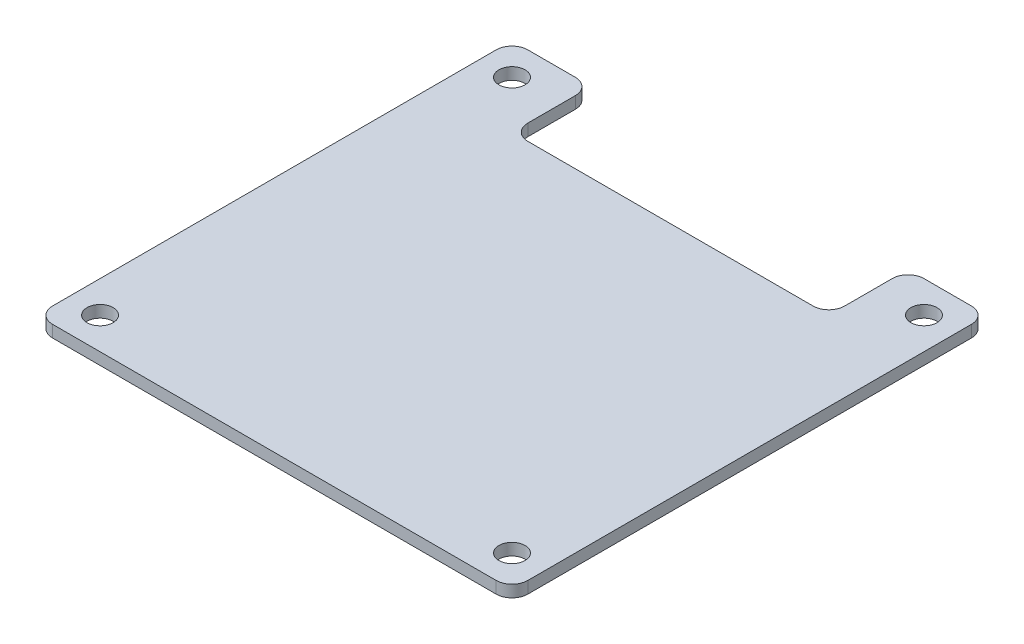
ISO-10303-21;
HEADER;
FILE_DESCRIPTION(('STEP AP214'),'2;1');
FILE_NAME('part.step','',(''),(''),'','','');
FILE_SCHEMA(('AUTOMOTIVE_DESIGN { 1 0 10303 214 1 1 1 1 }'));
ENDSEC;
DATA;
#1=APPLICATION_CONTEXT('core data for automotive mechanical design processes');
#2=APPLICATION_PROTOCOL_DEFINITION('international standard','automotive_design',2000,#1);
#3=PRODUCT_CONTEXT('',#1,'mechanical');
#4=PRODUCT('Part','Part','',(#3));
#5=PRODUCT_RELATED_PRODUCT_CATEGORY('part','',(#4));
#6=PRODUCT_DEFINITION_FORMATION('','',#4);
#7=PRODUCT_DEFINITION_CONTEXT('part definition',#1,'design');
#8=PRODUCT_DEFINITION('design','',#6,#7);
#9=PRODUCT_DEFINITION_SHAPE('','',#8);
#10=(LENGTH_UNIT() NAMED_UNIT(*) SI_UNIT(.MILLI.,.METRE.));
#11=(NAMED_UNIT(*) PLANE_ANGLE_UNIT() SI_UNIT($,.RADIAN.));
#12=(NAMED_UNIT(*) SI_UNIT($,.STERADIAN.) SOLID_ANGLE_UNIT());
#13=UNCERTAINTY_MEASURE_WITH_UNIT(LENGTH_MEASURE(1.E-05),#10,'distance_accuracy_value','');
#14=(GEOMETRIC_REPRESENTATION_CONTEXT(3) GLOBAL_UNCERTAINTY_ASSIGNED_CONTEXT((#13)) GLOBAL_UNIT_ASSIGNED_CONTEXT((#10,
#11,#12)) REPRESENTATION_CONTEXT('',''));
#15=CARTESIAN_POINT('',(0.,0.,0.));
#16=DIRECTION('',(0.,0.,1.));
#17=DIRECTION('',(1.,0.,0.));
#18=AXIS2_PLACEMENT_3D('',#15,#16,#17);
#19=CARTESIAN_POINT('',(18.,1.5,-22.));
#20=DIRECTION('',(0.,-1.,0.));
#21=DIRECTION('',(0.,0.,-1.));
#22=AXIS2_PLACEMENT_3D('',#19,#20,#21);
#23=PLANE('',#22);
#24=DIRECTION('',(1.,0.,0.));
#25=VECTOR('',#24,1.);
#26=CARTESIAN_POINT('',(-30.,1.5,30.));
#27=LINE('',#26,#25);
#28=CARTESIAN_POINT('',(-28.,1.5,30.));
#29=VERTEX_POINT('',#28);
#30=CARTESIAN_POINT('',(28.,1.5,30.));
#31=VERTEX_POINT('',#30);
#32=EDGE_CURVE('E216',#29,#31,#27,.T.);
#33=ORIENTED_EDGE('',*,*,#32,.T.);
#34=CARTESIAN_POINT('',(28.,1.5,28.));
#35=DIRECTION('',(0.,-1.,0.));
#36=DIRECTION('',(0.,0.,-1.));
#37=AXIS2_PLACEMENT_3D('',#34,#35,#36);
#38=CIRCLE('',#37,2.);
#39=CARTESIAN_POINT('',(30.,1.5,28.));
#40=VERTEX_POINT('',#39);
#41=EDGE_CURVE('E232',#31,#40,#38,.F.);
#42=ORIENTED_EDGE('',*,*,#41,.T.);
#43=DIRECTION('',(0.,0.,-1.));
#44=VECTOR('',#43,1.);
#45=CARTESIAN_POINT('',(30.,1.5,-30.));
#46=LINE('',#45,#44);
#47=CARTESIAN_POINT('',(30.,1.5,-28.));
#48=VERTEX_POINT('',#47);
#49=EDGE_CURVE('E221',#40,#48,#46,.T.);
#50=ORIENTED_EDGE('',*,*,#49,.T.);
#51=CARTESIAN_POINT('',(28.,1.5,-28.));
#52=DIRECTION('',(0.,-1.,0.));
#53=DIRECTION('',(0.,0.,-1.));
#54=AXIS2_PLACEMENT_3D('',#51,#52,#53);
#55=CIRCLE('',#54,2.);
#56=CARTESIAN_POINT('',(28.,1.5,-30.));
#57=VERTEX_POINT('',#56);
#58=EDGE_CURVE('E230',#48,#57,#55,.F.);
#59=ORIENTED_EDGE('',*,*,#58,.T.);
#60=DIRECTION('',(-1.,0.,0.));
#61=VECTOR('',#60,1.);
#62=CARTESIAN_POINT('',(20.,1.5,-30.));
#63=LINE('',#62,#61);
#64=CARTESIAN_POINT('',(22.,1.5,-30.));
#65=VERTEX_POINT('',#64);
#66=EDGE_CURVE('E165',#57,#65,#63,.T.);
#67=ORIENTED_EDGE('',*,*,#66,.T.);
#68=CARTESIAN_POINT('',(22.,1.5,-28.));
#69=DIRECTION('',(0.,-1.,0.));
#70=DIRECTION('',(0.,0.,-1.));
#71=AXIS2_PLACEMENT_3D('',#68,#69,#70);
#72=CIRCLE('',#71,2.);
#73=CARTESIAN_POINT('',(20.,1.5,-28.));
#74=VERTEX_POINT('',#73);
#75=EDGE_CURVE('E161',#65,#74,#72,.F.);
#76=ORIENTED_EDGE('',*,*,#75,.T.);
#77=DIRECTION('',(0.,0.,1.));
#78=VECTOR('',#77,1.);
#79=CARTESIAN_POINT('',(20.,1.5,-30.));
#80=LINE('',#79,#78);
#81=CARTESIAN_POINT('',(20.,1.5,-22.));
#82=VERTEX_POINT('',#81);
#83=EDGE_CURVE('E152',#74,#82,#80,.T.);
#84=ORIENTED_EDGE('',*,*,#83,.T.);
#85=CARTESIAN_POINT('',(18.,1.5,-22.));
#86=DIRECTION('',(0.,-1.,0.));
#87=DIRECTION('',(0.,0.,-1.));
#88=AXIS2_PLACEMENT_3D('',#85,#86,#87);
#89=CIRCLE('',#88,2.);
#90=CARTESIAN_POINT('',(18.,1.5,-20.));
#91=VERTEX_POINT('',#90);
#92=EDGE_CURVE('E157',#82,#91,#89,.T.);
#93=ORIENTED_EDGE('',*,*,#92,.T.);
#94=DIRECTION('',(-1.,0.,0.));
#95=VECTOR('',#94,1.);
#96=CARTESIAN_POINT('',(-18.,1.5,-20.));
#97=LINE('',#96,#95);
#98=CARTESIAN_POINT('',(-18.,1.5,-20.));
#99=VERTEX_POINT('',#98);
#100=EDGE_CURVE('E180',#91,#99,#97,.T.);
#101=ORIENTED_EDGE('',*,*,#100,.T.);
#102=CARTESIAN_POINT('',(-18.,1.5,-22.));
#103=DIRECTION('',(0.,-1.,0.));
#104=DIRECTION('',(0.,0.,-1.));
#105=AXIS2_PLACEMENT_3D('',#102,#103,#104);
#106=CIRCLE('',#105,2.);
#107=CARTESIAN_POINT('',(-20.,1.5,-22.));
#108=VERTEX_POINT('',#107);
#109=EDGE_CURVE('E182',#99,#108,#106,.T.);
#110=ORIENTED_EDGE('',*,*,#109,.T.);
#111=DIRECTION('',(0.,0.,-1.));
#112=VECTOR('',#111,1.);
#113=CARTESIAN_POINT('',(-20.,1.5,-30.));
#114=LINE('',#113,#112);
#115=CARTESIAN_POINT('',(-20.,1.5,-28.));
#116=VERTEX_POINT('',#115);
#117=EDGE_CURVE('E198',#108,#116,#114,.T.);
#118=ORIENTED_EDGE('',*,*,#117,.T.);
#119=CARTESIAN_POINT('',(-22.,1.5,-28.));
#120=DIRECTION('',(0.,-1.,0.));
#121=DIRECTION('',(0.,0.,-1.));
#122=AXIS2_PLACEMENT_3D('',#119,#120,#121);
#123=CIRCLE('',#122,2.);
#124=CARTESIAN_POINT('',(-22.,1.5,-30.));
#125=VERTEX_POINT('',#124);
#126=EDGE_CURVE('E61',#116,#125,#123,.F.);
#127=ORIENTED_EDGE('',*,*,#126,.T.);
#128=DIRECTION('',(-1.,0.,0.));
#129=VECTOR('',#128,1.);
#130=CARTESIAN_POINT('',(-30.,1.5,-30.));
#131=LINE('',#130,#129);
#132=CARTESIAN_POINT('',(-28.,1.5,-30.));
#133=VERTEX_POINT('',#132);
#134=EDGE_CURVE('E201',#125,#133,#131,.T.);
#135=ORIENTED_EDGE('',*,*,#134,.T.);
#136=CARTESIAN_POINT('',(-28.,1.5,-28.));
#137=DIRECTION('',(0.,-1.,0.));
#138=DIRECTION('',(0.,0.,-1.));
#139=AXIS2_PLACEMENT_3D('',#136,#137,#138);
#140=CIRCLE('',#139,2.);
#141=CARTESIAN_POINT('',(-30.,1.5,-28.));
#142=VERTEX_POINT('',#141);
#143=EDGE_CURVE('E269',#133,#142,#140,.F.);
#144=ORIENTED_EDGE('',*,*,#143,.T.);
#145=DIRECTION('',(0.,0.,1.));
#146=VECTOR('',#145,1.);
#147=CARTESIAN_POINT('',(-30.,1.5,-30.));
#148=LINE('',#147,#146);
#149=CARTESIAN_POINT('',(-30.,1.5,28.));
#150=VERTEX_POINT('',#149);
#151=EDGE_CURVE('E212',#142,#150,#148,.T.);
#152=ORIENTED_EDGE('',*,*,#151,.T.);
#153=CARTESIAN_POINT('',(-28.,1.5,28.));
#154=DIRECTION('',(0.,-1.,0.));
#155=DIRECTION('',(0.,0.,-1.));
#156=AXIS2_PLACEMENT_3D('',#153,#154,#155);
#157=CIRCLE('',#156,2.);
#158=EDGE_CURVE('E287',#150,#29,#157,.F.);
#159=ORIENTED_EDGE('',*,*,#158,.T.);
#160=EDGE_LOOP('',(#33,#42,#50,#59,#67,#76,#84,#93,#101,#110,#118,#127,#135,#144,#152,#159));
#161=FACE_BOUND('',#160,.T.);
#162=CARTESIAN_POINT('',(26.,1.5,-26.));
#163=DIRECTION('',(0.,1.,0.));
#164=DIRECTION('',(0.,0.,1.));
#165=AXIS2_PLACEMENT_3D('',#162,#163,#164);
#166=CIRCLE('',#165,1.65);
#167=CARTESIAN_POINT('',(26.,1.5,-24.35));
#168=VERTEX_POINT('',#167);
#169=EDGE_CURVE('E321',#168,#168,#166,.T.);
#170=ORIENTED_EDGE('',*,*,#169,.F.);
#171=EDGE_LOOP('',(#170));
#172=FACE_BOUND('',#171,.T.);
#173=CARTESIAN_POINT('',(-26.,1.5,26.));
#174=DIRECTION('',(0.,1.,0.));
#175=DIRECTION('',(0.,0.,1.));
#176=AXIS2_PLACEMENT_3D('',#173,#174,#175);
#177=CIRCLE('',#176,1.65);
#178=CARTESIAN_POINT('',(-26.,1.5,27.65));
#179=VERTEX_POINT('',#178);
#180=EDGE_CURVE('E328',#179,#179,#177,.T.);
#181=ORIENTED_EDGE('',*,*,#180,.F.);
#182=EDGE_LOOP('',(#181));
#183=FACE_BOUND('',#182,.T.);
#184=CARTESIAN_POINT('',(-26.,1.5,-26.));
#185=DIRECTION('',(0.,1.,0.));
#186=DIRECTION('',(0.,0.,1.));
#187=AXIS2_PLACEMENT_3D('',#184,#185,#186);
#188=CIRCLE('',#187,1.65);
#189=CARTESIAN_POINT('',(-26.,1.5,-24.35));
#190=VERTEX_POINT('',#189);
#191=EDGE_CURVE('E334',#190,#190,#188,.T.);
#192=ORIENTED_EDGE('',*,*,#191,.F.);
#193=EDGE_LOOP('',(#192));
#194=FACE_BOUND('',#193,.T.);
#195=CARTESIAN_POINT('',(26.,1.5,26.));
#196=DIRECTION('',(0.,1.,0.));
#197=DIRECTION('',(0.,0.,1.));
#198=AXIS2_PLACEMENT_3D('',#195,#196,#197);
#199=CIRCLE('',#198,1.65);
#200=CARTESIAN_POINT('',(26.,1.5,27.65));
#201=VERTEX_POINT('',#200);
#202=EDGE_CURVE('E345',#201,#201,#199,.T.);
#203=ORIENTED_EDGE('',*,*,#202,.F.);
#204=EDGE_LOOP('',(#203));
#205=FACE_BOUND('',#204,.T.);
#206=ADVANCED_FACE('F39',(#161,#172,#183,#194,#205),#23,.F.);
#207=CARTESIAN_POINT('',(18.,0.,-22.));
#208=DIRECTION('',(0.,-1.,0.));
#209=DIRECTION('',(0.,0.,-1.));
#210=AXIS2_PLACEMENT_3D('',#207,#208,#209);
#211=PLANE('',#210);
#212=CARTESIAN_POINT('',(-26.,0.,-26.));
#213=DIRECTION('',(0.,1.,0.));
#214=DIRECTION('',(0.,0.,1.));
#215=AXIS2_PLACEMENT_3D('',#212,#213,#214);
#216=CIRCLE('',#215,1.65);
#217=CARTESIAN_POINT('',(-26.,0.,-24.35));
#218=VERTEX_POINT('',#217);
#219=EDGE_CURVE('E338',#218,#218,#216,.T.);
#220=ORIENTED_EDGE('',*,*,#219,.T.);
#221=EDGE_LOOP('',(#220));
#222=FACE_BOUND('',#221,.T.);
#223=CARTESIAN_POINT('',(26.,0.,-26.));
#224=DIRECTION('',(0.,1.,0.));
#225=DIRECTION('',(0.,0.,1.));
#226=AXIS2_PLACEMENT_3D('',#223,#224,#225);
#227=CIRCLE('',#226,1.65);
#228=CARTESIAN_POINT('',(26.,0.,-24.35));
#229=VERTEX_POINT('',#228);
#230=EDGE_CURVE('E218',#229,#229,#227,.T.);
#231=ORIENTED_EDGE('',*,*,#230,.T.);
#232=EDGE_LOOP('',(#231));
#233=FACE_BOUND('',#232,.T.);
#234=DIRECTION('',(0.,0.,-1.));
#235=VECTOR('',#234,1.);
#236=CARTESIAN_POINT('',(30.,0.,-30.));
#237=LINE('',#236,#235);
#238=CARTESIAN_POINT('',(30.,0.,28.));
#239=VERTEX_POINT('',#238);
#240=CARTESIAN_POINT('',(30.,0.,-28.));
#241=VERTEX_POINT('',#240);
#242=EDGE_CURVE('E314',#239,#241,#237,.T.);
#243=ORIENTED_EDGE('',*,*,#242,.F.);
#244=CARTESIAN_POINT('',(28.,0.,28.));
#245=DIRECTION('',(0.,-1.,0.));
#246=DIRECTION('',(0.,0.,-1.));
#247=AXIS2_PLACEMENT_3D('',#244,#245,#246);
#248=CIRCLE('',#247,2.);
#249=CARTESIAN_POINT('',(28.,0.,30.));
#250=VERTEX_POINT('',#249);
#251=EDGE_CURVE('E274',#239,#250,#248,.T.);
#252=ORIENTED_EDGE('',*,*,#251,.T.);
#253=DIRECTION('',(1.,0.,0.));
#254=VECTOR('',#253,1.);
#255=CARTESIAN_POINT('',(-30.,0.,30.));
#256=LINE('',#255,#254);
#257=CARTESIAN_POINT('',(-28.,0.,30.));
#258=VERTEX_POINT('',#257);
#259=EDGE_CURVE('E316',#258,#250,#256,.T.);
#260=ORIENTED_EDGE('',*,*,#259,.F.);
#261=CARTESIAN_POINT('',(-28.,0.,28.));
#262=DIRECTION('',(0.,-1.,0.));
#263=DIRECTION('',(0.,0.,-1.));
#264=AXIS2_PLACEMENT_3D('',#261,#262,#263);
#265=CIRCLE('',#264,2.);
#266=CARTESIAN_POINT('',(-30.,0.,28.));
#267=VERTEX_POINT('',#266);
#268=EDGE_CURVE('E292',#258,#267,#265,.T.);
#269=ORIENTED_EDGE('',*,*,#268,.T.);
#270=DIRECTION('',(0.,0.,1.));
#271=VECTOR('',#270,1.);
#272=CARTESIAN_POINT('',(-30.,0.,-30.));
#273=LINE('',#272,#271);
#274=CARTESIAN_POINT('',(-30.,0.,-28.));
#275=VERTEX_POINT('',#274);
#276=EDGE_CURVE('E205',#275,#267,#273,.T.);
#277=ORIENTED_EDGE('',*,*,#276,.F.);
#278=CARTESIAN_POINT('',(-28.,0.,-28.));
#279=DIRECTION('',(0.,-1.,0.));
#280=DIRECTION('',(0.,0.,-1.));
#281=AXIS2_PLACEMENT_3D('',#278,#279,#280);
#282=CIRCLE('',#281,2.);
#283=CARTESIAN_POINT('',(-28.,0.,-30.));
#284=VERTEX_POINT('',#283);
#285=EDGE_CURVE('E282',#275,#284,#282,.T.);
#286=ORIENTED_EDGE('',*,*,#285,.T.);
#287=DIRECTION('',(-1.,0.,0.));
#288=VECTOR('',#287,1.);
#289=CARTESIAN_POINT('',(-30.,0.,-30.));
#290=LINE('',#289,#288);
#291=CARTESIAN_POINT('',(-22.,0.,-30.));
#292=VERTEX_POINT('',#291);
#293=EDGE_CURVE('E217',#292,#284,#290,.T.);
#294=ORIENTED_EDGE('',*,*,#293,.F.);
#295=CARTESIAN_POINT('',(-22.,0.,-28.));
#296=DIRECTION('',(0.,-1.,0.));
#297=DIRECTION('',(0.,0.,-1.));
#298=AXIS2_PLACEMENT_3D('',#295,#296,#297);
#299=CIRCLE('',#298,2.);
#300=CARTESIAN_POINT('',(-20.,0.,-28.));
#301=VERTEX_POINT('',#300);
#302=EDGE_CURVE('E280',#292,#301,#299,.T.);
#303=ORIENTED_EDGE('',*,*,#302,.T.);
#304=DIRECTION('',(0.,0.,-1.));
#305=VECTOR('',#304,1.);
#306=CARTESIAN_POINT('',(-20.,0.,-30.));
#307=LINE('',#306,#305);
#308=CARTESIAN_POINT('',(-20.,0.,-22.));
#309=VERTEX_POINT('',#308);
#310=EDGE_CURVE('E263',#309,#301,#307,.T.);
#311=ORIENTED_EDGE('',*,*,#310,.F.);
#312=CARTESIAN_POINT('',(-18.,0.,-22.));
#313=DIRECTION('',(0.,-1.,0.));
#314=DIRECTION('',(0.,0.,-1.));
#315=AXIS2_PLACEMENT_3D('',#312,#313,#314);
#316=CIRCLE('',#315,2.);
#317=CARTESIAN_POINT('',(-18.,0.,-20.));
#318=VERTEX_POINT('',#317);
#319=EDGE_CURVE('E304',#318,#309,#316,.T.);
#320=ORIENTED_EDGE('',*,*,#319,.F.);
#321=DIRECTION('',(-1.,0.,0.));
#322=VECTOR('',#321,1.);
#323=CARTESIAN_POINT('',(-18.,0.,-20.));
#324=LINE('',#323,#322);
#325=CARTESIAN_POINT('',(18.,0.,-20.));
#326=VERTEX_POINT('',#325);
#327=EDGE_CURVE('E306',#326,#318,#324,.T.);
#328=ORIENTED_EDGE('',*,*,#327,.F.);
#329=CARTESIAN_POINT('',(18.,0.,-22.));
#330=DIRECTION('',(0.,-1.,0.));
#331=DIRECTION('',(0.,0.,-1.));
#332=AXIS2_PLACEMENT_3D('',#329,#330,#331);
#333=CIRCLE('',#332,2.);
#334=CARTESIAN_POINT('',(20.,0.,-22.));
#335=VERTEX_POINT('',#334);
#336=EDGE_CURVE('E308',#335,#326,#333,.T.);
#337=ORIENTED_EDGE('',*,*,#336,.F.);
#338=DIRECTION('',(0.,0.,1.));
#339=VECTOR('',#338,1.);
#340=CARTESIAN_POINT('',(20.,0.,-30.));
#341=LINE('',#340,#339);
#342=CARTESIAN_POINT('',(20.,0.,-28.));
#343=VERTEX_POINT('',#342);
#344=EDGE_CURVE('E171',#343,#335,#341,.T.);
#345=ORIENTED_EDGE('',*,*,#344,.F.);
#346=CARTESIAN_POINT('',(22.,0.,-28.));
#347=DIRECTION('',(0.,-1.,0.));
#348=DIRECTION('',(0.,0.,-1.));
#349=AXIS2_PLACEMENT_3D('',#346,#347,#348);
#350=CIRCLE('',#349,2.);
#351=CARTESIAN_POINT('',(22.,0.,-30.));
#352=VERTEX_POINT('',#351);
#353=EDGE_CURVE('E278',#343,#352,#350,.T.);
#354=ORIENTED_EDGE('',*,*,#353,.T.);
#355=DIRECTION('',(-1.,0.,0.));
#356=VECTOR('',#355,1.);
#357=CARTESIAN_POINT('',(20.,0.,-30.));
#358=LINE('',#357,#356);
#359=CARTESIAN_POINT('',(28.,0.,-30.));
#360=VERTEX_POINT('',#359);
#361=EDGE_CURVE('E311',#360,#352,#358,.T.);
#362=ORIENTED_EDGE('',*,*,#361,.F.);
#363=CARTESIAN_POINT('',(28.,0.,-28.));
#364=DIRECTION('',(0.,-1.,0.));
#365=DIRECTION('',(0.,0.,-1.));
#366=AXIS2_PLACEMENT_3D('',#363,#364,#365);
#367=CIRCLE('',#366,2.);
#368=EDGE_CURVE('E276',#360,#241,#367,.T.);
#369=ORIENTED_EDGE('',*,*,#368,.T.);
#370=EDGE_LOOP('',(#243,#252,#260,#269,#277,#286,#294,#303,#311,#320,#328,#337,#345,#354,#362,#369));
#371=FACE_BOUND('',#370,.T.);
#372=CARTESIAN_POINT('',(-26.,0.,26.));
#373=DIRECTION('',(0.,1.,0.));
#374=DIRECTION('',(0.,0.,1.));
#375=AXIS2_PLACEMENT_3D('',#372,#373,#374);
#376=CIRCLE('',#375,1.65);
#377=CARTESIAN_POINT('',(-26.,0.,27.65));
#378=VERTEX_POINT('',#377);
#379=EDGE_CURVE('E331',#378,#378,#376,.T.);
#380=ORIENTED_EDGE('',*,*,#379,.T.);
#381=EDGE_LOOP('',(#380));
#382=FACE_BOUND('',#381,.T.);
#383=CARTESIAN_POINT('',(26.,0.,26.));
#384=DIRECTION('',(0.,1.,0.));
#385=DIRECTION('',(0.,0.,1.));
#386=AXIS2_PLACEMENT_3D('',#383,#384,#385);
#387=CIRCLE('',#386,1.65);
#388=CARTESIAN_POINT('',(26.,0.,27.65));
#389=VERTEX_POINT('',#388);
#390=EDGE_CURVE('E343',#389,#389,#387,.T.);
#391=ORIENTED_EDGE('',*,*,#390,.T.);
#392=EDGE_LOOP('',(#391));
#393=FACE_BOUND('',#392,.T.);
#394=ADVANCED_FACE('F353',(#222,#233,#371,#382,#393),#211,.T.);
#395=CARTESIAN_POINT('',(-30.,1.5,-30.));
#396=DIRECTION('',(1.,0.,0.));
#397=DIRECTION('',(0.,0.,-1.));
#398=AXIS2_PLACEMENT_3D('',#395,#396,#397);
#399=PLANE('',#398);
#400=ORIENTED_EDGE('',*,*,#151,.F.);
#401=DIRECTION('',(0.,-1.,0.));
#402=VECTOR('',#401,1.);
#403=CARTESIAN_POINT('',(-30.,1.5,-28.));
#404=LINE('',#403,#402);
#405=EDGE_CURVE('E12',#142,#275,#404,.T.);
#406=ORIENTED_EDGE('',*,*,#405,.T.);
#407=ORIENTED_EDGE('',*,*,#276,.T.);
#408=DIRECTION('',(0.,-1.,0.));
#409=VECTOR('',#408,1.);
#410=CARTESIAN_POINT('',(-30.,1.5,28.));
#411=LINE('',#410,#409);
#412=EDGE_CURVE('E289',#267,#150,#411,.F.);
#413=ORIENTED_EDGE('',*,*,#412,.T.);
#414=EDGE_LOOP('',(#400,#406,#407,#413));
#415=FACE_BOUND('',#414,.T.);
#416=ADVANCED_FACE('F376',(#415),#399,.F.);
#417=CARTESIAN_POINT('',(-30.,1.5,30.));
#418=DIRECTION('',(0.,0.,-1.));
#419=DIRECTION('',(-1.,0.,0.));
#420=AXIS2_PLACEMENT_3D('',#417,#418,#419);
#421=PLANE('',#420);
#422=ORIENTED_EDGE('',*,*,#259,.T.);
#423=DIRECTION('',(0.,-1.,0.));
#424=VECTOR('',#423,1.);
#425=CARTESIAN_POINT('',(28.,1.5,30.));
#426=LINE('',#425,#424);
#427=EDGE_CURVE('E270',#250,#31,#426,.F.);
#428=ORIENTED_EDGE('',*,*,#427,.T.);
#429=ORIENTED_EDGE('',*,*,#32,.F.);
#430=DIRECTION('',(0.,-1.,0.));
#431=VECTOR('',#430,1.);
#432=CARTESIAN_POINT('',(-28.,1.5,30.));
#433=LINE('',#432,#431);
#434=EDGE_CURVE('E174',#29,#258,#433,.T.);
#435=ORIENTED_EDGE('',*,*,#434,.T.);
#436=EDGE_LOOP('',(#422,#428,#429,#435));
#437=FACE_BOUND('',#436,.T.);
#438=ADVANCED_FACE('F404',(#437),#421,.F.);
#439=CARTESIAN_POINT('',(30.,1.5,-30.));
#440=DIRECTION('',(-1.,0.,0.));
#441=DIRECTION('',(0.,0.,1.));
#442=AXIS2_PLACEMENT_3D('',#439,#440,#441);
#443=PLANE('',#442);
#444=ORIENTED_EDGE('',*,*,#49,.F.);
#445=DIRECTION('',(0.,-1.,0.));
#446=VECTOR('',#445,1.);
#447=CARTESIAN_POINT('',(30.,1.5,28.));
#448=LINE('',#447,#446);
#449=EDGE_CURVE('E284',#40,#239,#448,.T.);
#450=ORIENTED_EDGE('',*,*,#449,.T.);
#451=ORIENTED_EDGE('',*,*,#242,.T.);
#452=DIRECTION('',(0.,-1.,0.));
#453=VECTOR('',#452,1.);
#454=CARTESIAN_POINT('',(30.,1.5,-28.));
#455=LINE('',#454,#453);
#456=EDGE_CURVE('E240',#241,#48,#455,.F.);
#457=ORIENTED_EDGE('',*,*,#456,.T.);
#458=EDGE_LOOP('',(#444,#450,#451,#457));
#459=FACE_BOUND('',#458,.T.);
#460=ADVANCED_FACE('F400',(#459),#443,.F.);
#461=CARTESIAN_POINT('',(20.,1.5,-30.));
#462=DIRECTION('',(0.,0.,1.));
#463=DIRECTION('',(1.,0.,0.));
#464=AXIS2_PLACEMENT_3D('',#461,#462,#463);
#465=PLANE('',#464);
#466=ORIENTED_EDGE('',*,*,#66,.F.);
#467=DIRECTION('',(0.,-1.,0.));
#468=VECTOR('',#467,1.);
#469=CARTESIAN_POINT('',(28.,1.5,-30.));
#470=LINE('',#469,#468);
#471=EDGE_CURVE('E242',#57,#360,#470,.T.);
#472=ORIENTED_EDGE('',*,*,#471,.T.);
#473=ORIENTED_EDGE('',*,*,#361,.T.);
#474=DIRECTION('',(0.,-1.,0.));
#475=VECTOR('',#474,1.);
#476=CARTESIAN_POINT('',(22.,1.5,-30.));
#477=LINE('',#476,#475);
#478=EDGE_CURVE('E244',#352,#65,#477,.F.);
#479=ORIENTED_EDGE('',*,*,#478,.T.);
#480=EDGE_LOOP('',(#466,#472,#473,#479));
#481=FACE_BOUND('',#480,.T.);
#482=ADVANCED_FACE('F397',(#481),#465,.F.);
#483=CARTESIAN_POINT('',(20.,1.5,-30.));
#484=DIRECTION('',(1.,0.,0.));
#485=DIRECTION('',(0.,0.,-1.));
#486=AXIS2_PLACEMENT_3D('',#483,#484,#485);
#487=PLANE('',#486);
#488=ORIENTED_EDGE('',*,*,#83,.F.);
#489=DIRECTION('',(0.,-1.,0.));
#490=VECTOR('',#489,1.);
#491=CARTESIAN_POINT('',(20.,1.5,-28.));
#492=LINE('',#491,#490);
#493=EDGE_CURVE('E251',#74,#343,#492,.T.);
#494=ORIENTED_EDGE('',*,*,#493,.T.);
#495=ORIENTED_EDGE('',*,*,#344,.T.);
#496=DIRECTION('',(0.,-1.,0.));
#497=VECTOR('',#496,1.);
#498=CARTESIAN_POINT('',(20.,1.5,-22.));
#499=LINE('',#498,#497);
#500=EDGE_CURVE('E168',#82,#335,#499,.T.);
#501=ORIENTED_EDGE('',*,*,#500,.F.);
#502=EDGE_LOOP('',(#488,#494,#495,#501));
#503=FACE_BOUND('',#502,.T.);
#504=ADVANCED_FACE('F169',(#503),#487,.F.);
#505=CARTESIAN_POINT('',(18.,1.5,-22.));
#506=DIRECTION('',(0.,-1.,0.));
#507=DIRECTION('',(0.,0.,-1.));
#508=AXIS2_PLACEMENT_3D('',#505,#506,#507);
#509=CYLINDRICAL_SURFACE('',#508,2.);
#510=ORIENTED_EDGE('',*,*,#336,.T.);
#511=DIRECTION('',(0.,-1.,0.));
#512=VECTOR('',#511,1.);
#513=CARTESIAN_POINT('',(18.,1.5,-20.));
#514=LINE('',#513,#512);
#515=EDGE_CURVE('E175',#91,#326,#514,.T.);
#516=ORIENTED_EDGE('',*,*,#515,.F.);
#517=ORIENTED_EDGE('',*,*,#92,.F.);
#518=ORIENTED_EDGE('',*,*,#500,.T.);
#519=EDGE_LOOP('',(#510,#516,#517,#518));
#520=FACE_BOUND('',#519,.T.);
#521=ADVANCED_FACE('F177',(#520),#509,.F.);
#522=CARTESIAN_POINT('',(-18.,1.5,-20.));
#523=DIRECTION('',(0.,0.,1.));
#524=DIRECTION('',(1.,0.,0.));
#525=AXIS2_PLACEMENT_3D('',#522,#523,#524);
#526=PLANE('',#525);
#527=ORIENTED_EDGE('',*,*,#327,.T.);
#528=DIRECTION('',(0.,-1.,0.));
#529=VECTOR('',#528,1.);
#530=CARTESIAN_POINT('',(-18.,1.5,-20.));
#531=LINE('',#530,#529);
#532=EDGE_CURVE('E298',#99,#318,#531,.T.);
#533=ORIENTED_EDGE('',*,*,#532,.F.);
#534=ORIENTED_EDGE('',*,*,#100,.F.);
#535=ORIENTED_EDGE('',*,*,#515,.T.);
#536=EDGE_LOOP('',(#527,#533,#534,#535));
#537=FACE_BOUND('',#536,.T.);
#538=ADVANCED_FACE('F388',(#537),#526,.F.);
#539=CARTESIAN_POINT('',(-18.,1.5,-22.));
#540=DIRECTION('',(0.,-1.,0.));
#541=DIRECTION('',(0.,0.,-1.));
#542=AXIS2_PLACEMENT_3D('',#539,#540,#541);
#543=CYLINDRICAL_SURFACE('',#542,2.);
#544=ORIENTED_EDGE('',*,*,#319,.T.);
#545=DIRECTION('',(0.,-1.,0.));
#546=VECTOR('',#545,1.);
#547=CARTESIAN_POINT('',(-20.,1.5,-22.));
#548=LINE('',#547,#546);
#549=EDGE_CURVE('E204',#108,#309,#548,.T.);
#550=ORIENTED_EDGE('',*,*,#549,.F.);
#551=ORIENTED_EDGE('',*,*,#109,.F.);
#552=ORIENTED_EDGE('',*,*,#532,.T.);
#553=EDGE_LOOP('',(#544,#550,#551,#552));
#554=FACE_BOUND('',#553,.T.);
#555=ADVANCED_FACE('F385',(#554),#543,.F.);
#556=CARTESIAN_POINT('',(-20.,1.5,-30.));
#557=DIRECTION('',(-1.,0.,0.));
#558=DIRECTION('',(0.,0.,1.));
#559=AXIS2_PLACEMENT_3D('',#556,#557,#558);
#560=PLANE('',#559);
#561=ORIENTED_EDGE('',*,*,#310,.T.);
#562=DIRECTION('',(0.,-1.,0.));
#563=VECTOR('',#562,1.);
#564=CARTESIAN_POINT('',(-20.,1.5,-28.));
#565=LINE('',#564,#563);
#566=EDGE_CURVE('E47',#301,#116,#565,.F.);
#567=ORIENTED_EDGE('',*,*,#566,.T.);
#568=ORIENTED_EDGE('',*,*,#117,.F.);
#569=ORIENTED_EDGE('',*,*,#549,.T.);
#570=EDGE_LOOP('',(#561,#567,#568,#569));
#571=FACE_BOUND('',#570,.T.);
#572=ADVANCED_FACE('F260',(#571),#560,.F.);
#573=CARTESIAN_POINT('',(-30.,1.5,-30.));
#574=DIRECTION('',(0.,0.,1.));
#575=DIRECTION('',(1.,0.,0.));
#576=AXIS2_PLACEMENT_3D('',#573,#574,#575);
#577=PLANE('',#576);
#578=ORIENTED_EDGE('',*,*,#134,.F.);
#579=DIRECTION('',(0.,-1.,0.));
#580=VECTOR('',#579,1.);
#581=CARTESIAN_POINT('',(-22.,1.5,-30.));
#582=LINE('',#581,#580);
#583=EDGE_CURVE('E254',#125,#292,#582,.T.);
#584=ORIENTED_EDGE('',*,*,#583,.T.);
#585=ORIENTED_EDGE('',*,*,#293,.T.);
#586=DIRECTION('',(0.,-1.,0.));
#587=VECTOR('',#586,1.);
#588=CARTESIAN_POINT('',(-28.,1.5,-30.));
#589=LINE('',#588,#587);
#590=EDGE_CURVE('E54',#284,#133,#589,.F.);
#591=ORIENTED_EDGE('',*,*,#590,.T.);
#592=EDGE_LOOP('',(#578,#584,#585,#591));
#593=FACE_BOUND('',#592,.T.);
#594=ADVANCED_FACE('F380',(#593),#577,.F.);
#595=CARTESIAN_POINT('',(26.,1.5,-26.));
#596=DIRECTION('',(0.,-1.,0.));
#597=DIRECTION('',(0.,0.,-1.));
#598=AXIS2_PLACEMENT_3D('',#595,#596,#597);
#599=CYLINDRICAL_SURFACE('',#598,1.65);
#600=ORIENTED_EDGE('',*,*,#169,.T.);
#601=EDGE_LOOP('',(#600));
#602=FACE_BOUND('',#601,.T.);
#603=ORIENTED_EDGE('',*,*,#230,.F.);
#604=EDGE_LOOP('',(#603));
#605=FACE_BOUND('',#604,.T.);
#606=ADVANCED_FACE('F368',(#602,#605),#599,.F.);
#607=CARTESIAN_POINT('',(-26.,1.5,26.));
#608=DIRECTION('',(0.,-1.,0.));
#609=DIRECTION('',(0.,0.,-1.));
#610=AXIS2_PLACEMENT_3D('',#607,#608,#609);
#611=CYLINDRICAL_SURFACE('',#610,1.65);
#612=ORIENTED_EDGE('',*,*,#180,.T.);
#613=EDGE_LOOP('',(#612));
#614=FACE_BOUND('',#613,.T.);
#615=ORIENTED_EDGE('',*,*,#379,.F.);
#616=EDGE_LOOP('',(#615));
#617=FACE_BOUND('',#616,.T.);
#618=ADVANCED_FACE('F359',(#614,#617),#611,.F.);
#619=CARTESIAN_POINT('',(-26.,1.5,-26.));
#620=DIRECTION('',(0.,-1.,0.));
#621=DIRECTION('',(0.,0.,-1.));
#622=AXIS2_PLACEMENT_3D('',#619,#620,#621);
#623=CYLINDRICAL_SURFACE('',#622,1.65);
#624=ORIENTED_EDGE('',*,*,#191,.T.);
#625=EDGE_LOOP('',(#624));
#626=FACE_BOUND('',#625,.T.);
#627=ORIENTED_EDGE('',*,*,#219,.F.);
#628=EDGE_LOOP('',(#627));
#629=FACE_BOUND('',#628,.T.);
#630=ADVANCED_FACE('F356',(#626,#629),#623,.F.);
#631=CARTESIAN_POINT('',(26.,1.5,26.));
#632=DIRECTION('',(0.,-1.,0.));
#633=DIRECTION('',(0.,0.,-1.));
#634=AXIS2_PLACEMENT_3D('',#631,#632,#633);
#635=CYLINDRICAL_SURFACE('',#634,1.65);
#636=ORIENTED_EDGE('',*,*,#202,.T.);
#637=EDGE_LOOP('',(#636));
#638=FACE_BOUND('',#637,.T.);
#639=ORIENTED_EDGE('',*,*,#390,.F.);
#640=EDGE_LOOP('',(#639));
#641=FACE_BOUND('',#640,.T.);
#642=ADVANCED_FACE('F358',(#638,#641),#635,.F.);
#643=CARTESIAN_POINT('',(-28.,1.5,28.));
#644=DIRECTION('',(0.,-1.,0.));
#645=DIRECTION('',(0.,0.,-1.));
#646=AXIS2_PLACEMENT_3D('',#643,#644,#645);
#647=CYLINDRICAL_SURFACE('',#646,2.);
#648=ORIENTED_EDGE('',*,*,#158,.F.);
#649=ORIENTED_EDGE('',*,*,#412,.F.);
#650=ORIENTED_EDGE('',*,*,#268,.F.);
#651=ORIENTED_EDGE('',*,*,#434,.F.);
#652=EDGE_LOOP('',(#648,#649,#650,#651));
#653=FACE_BOUND('',#652,.T.);
#654=ADVANCED_FACE('F366',(#653),#647,.T.);
#655=CARTESIAN_POINT('',(28.,1.5,28.));
#656=DIRECTION('',(0.,-1.,0.));
#657=DIRECTION('',(0.,0.,-1.));
#658=AXIS2_PLACEMENT_3D('',#655,#656,#657);
#659=CYLINDRICAL_SURFACE('',#658,2.);
#660=ORIENTED_EDGE('',*,*,#41,.F.);
#661=ORIENTED_EDGE('',*,*,#427,.F.);
#662=ORIENTED_EDGE('',*,*,#251,.F.);
#663=ORIENTED_EDGE('',*,*,#449,.F.);
#664=EDGE_LOOP('',(#660,#661,#662,#663));
#665=FACE_BOUND('',#664,.T.);
#666=ADVANCED_FACE('F411',(#665),#659,.T.);
#667=CARTESIAN_POINT('',(28.,1.5,-28.));
#668=DIRECTION('',(0.,-1.,0.));
#669=DIRECTION('',(0.,0.,-1.));
#670=AXIS2_PLACEMENT_3D('',#667,#668,#669);
#671=CYLINDRICAL_SURFACE('',#670,2.);
#672=ORIENTED_EDGE('',*,*,#58,.F.);
#673=ORIENTED_EDGE('',*,*,#456,.F.);
#674=ORIENTED_EDGE('',*,*,#368,.F.);
#675=ORIENTED_EDGE('',*,*,#471,.F.);
#676=EDGE_LOOP('',(#672,#673,#674,#675));
#677=FACE_BOUND('',#676,.T.);
#678=ADVANCED_FACE('F239',(#677),#671,.T.);
#679=CARTESIAN_POINT('',(22.,1.5,-28.));
#680=DIRECTION('',(0.,-1.,0.));
#681=DIRECTION('',(0.,0.,-1.));
#682=AXIS2_PLACEMENT_3D('',#679,#680,#681);
#683=CYLINDRICAL_SURFACE('',#682,2.);
#684=ORIENTED_EDGE('',*,*,#75,.F.);
#685=ORIENTED_EDGE('',*,*,#478,.F.);
#686=ORIENTED_EDGE('',*,*,#353,.F.);
#687=ORIENTED_EDGE('',*,*,#493,.F.);
#688=EDGE_LOOP('',(#684,#685,#686,#687));
#689=FACE_BOUND('',#688,.T.);
#690=ADVANCED_FACE('F418',(#689),#683,.T.);
#691=CARTESIAN_POINT('',(-22.,1.5,-28.));
#692=DIRECTION('',(0.,-1.,0.));
#693=DIRECTION('',(0.,0.,-1.));
#694=AXIS2_PLACEMENT_3D('',#691,#692,#693);
#695=CYLINDRICAL_SURFACE('',#694,2.);
#696=ORIENTED_EDGE('',*,*,#126,.F.);
#697=ORIENTED_EDGE('',*,*,#566,.F.);
#698=ORIENTED_EDGE('',*,*,#302,.F.);
#699=ORIENTED_EDGE('',*,*,#583,.F.);
#700=EDGE_LOOP('',(#696,#697,#698,#699));
#701=FACE_BOUND('',#700,.T.);
#702=ADVANCED_FACE('F268',(#701),#695,.T.);
#703=CARTESIAN_POINT('',(-28.,1.5,-28.));
#704=DIRECTION('',(0.,-1.,0.));
#705=DIRECTION('',(0.,0.,-1.));
#706=AXIS2_PLACEMENT_3D('',#703,#704,#705);
#707=CYLINDRICAL_SURFACE('',#706,2.);
#708=ORIENTED_EDGE('',*,*,#143,.F.);
#709=ORIENTED_EDGE('',*,*,#590,.F.);
#710=ORIENTED_EDGE('',*,*,#285,.F.);
#711=ORIENTED_EDGE('',*,*,#405,.F.);
#712=EDGE_LOOP('',(#708,#709,#710,#711));
#713=FACE_BOUND('',#712,.T.);
#714=ADVANCED_FACE('F41',(#713),#707,.T.);
#715=CLOSED_SHELL('',(#206,#394,#416,#438,#460,#482,#504,#521,#538,#555,#572,#594,#606,#618,
#630,#642,#654,#666,#678,#690,#702,#714));
#716=MANIFOLD_SOLID_BREP('B2',#715);
#717=ADVANCED_BREP_SHAPE_REPRESENTATION('',(#18,#716),#14);
#718=SHAPE_DEFINITION_REPRESENTATION(#9,#717);
ENDSEC;
END-ISO-10303-21;
